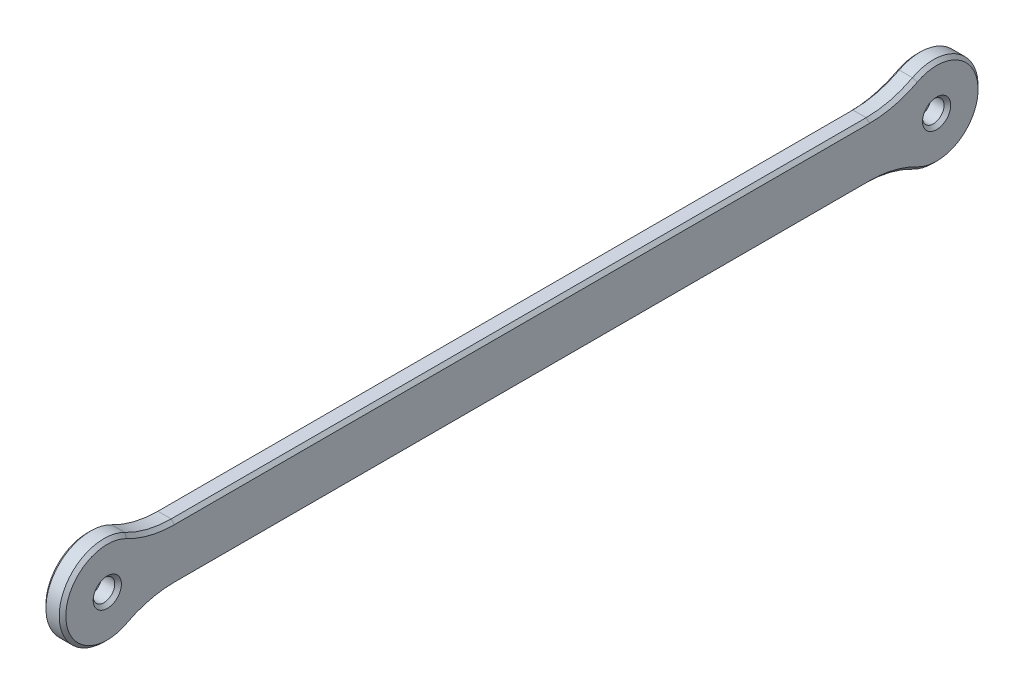
ISO-10303-21;
HEADER;
FILE_DESCRIPTION(('STEP AP214'),'2;1');
FILE_NAME('part.step','',(''),(''),'','','');
FILE_SCHEMA(('AUTOMOTIVE_DESIGN { 1 0 10303 214 1 1 1 1 }'));
ENDSEC;
DATA;
#1=APPLICATION_CONTEXT('core data for automotive mechanical design processes');
#2=APPLICATION_PROTOCOL_DEFINITION('international standard','automotive_design',2000,#1);
#3=PRODUCT_CONTEXT('',#1,'mechanical');
#4=PRODUCT('Part','Part','',(#3));
#5=PRODUCT_RELATED_PRODUCT_CATEGORY('part','',(#4));
#6=PRODUCT_DEFINITION_FORMATION('','',#4);
#7=PRODUCT_DEFINITION_CONTEXT('part definition',#1,'design');
#8=PRODUCT_DEFINITION('design','',#6,#7);
#9=PRODUCT_DEFINITION_SHAPE('','',#8);
#10=(LENGTH_UNIT() NAMED_UNIT(*) SI_UNIT(.MILLI.,.METRE.));
#11=(NAMED_UNIT(*) PLANE_ANGLE_UNIT() SI_UNIT($,.RADIAN.));
#12=(NAMED_UNIT(*) SI_UNIT($,.STERADIAN.) SOLID_ANGLE_UNIT());
#13=UNCERTAINTY_MEASURE_WITH_UNIT(LENGTH_MEASURE(1.E-05),#10,'distance_accuracy_value','');
#14=(GEOMETRIC_REPRESENTATION_CONTEXT(3) GLOBAL_UNCERTAINTY_ASSIGNED_CONTEXT((#13)) GLOBAL_UNIT_ASSIGNED_CONTEXT((#10,
#11,#12)) REPRESENTATION_CONTEXT('',''));
#15=CARTESIAN_POINT('',(0.,0.,0.));
#16=DIRECTION('',(0.,0.,1.));
#17=DIRECTION('',(1.,0.,0.));
#18=AXIS2_PLACEMENT_3D('',#15,#16,#17);
#19=CARTESIAN_POINT('',(1.5,19.25,-52.3757716343417));
#20=DIRECTION('',(-1.,0.,0.));
#21=DIRECTION('',(0.,0.,1.));
#22=AXIS2_PLACEMENT_3D('',#19,#20,#21);
#23=CYLINDRICAL_SURFACE('',#22,15.);
#24=DIRECTION('',(-1.,0.,0.));
#25=VECTOR('',#24,1.);
#26=CARTESIAN_POINT('',(1.5,5.97413793103448,-59.3579980934164));
#27=LINE('',#26,#25);
#28=CARTESIAN_POINT('',(1.00000000000007,5.97413793103448,-59.3579980934164));
#29=VERTEX_POINT('',#28);
#30=CARTESIAN_POINT('',(-1.00000000000001,5.97413793103448,-59.3579980934164));
#31=VERTEX_POINT('',#30);
#32=EDGE_CURVE('E261',#29,#31,#27,.T.);
#33=ORIENTED_EDGE('',*,*,#32,.T.);
#34=CARTESIAN_POINT('',(-1.00000000000001,19.25,-52.3757716343417));
#35=DIRECTION('',(1.,0.,0.));
#36=DIRECTION('',(0.,0.,-1.));
#37=AXIS2_PLACEMENT_3D('',#34,#35,#36);
#38=CIRCLE('',#37,15.);
#39=CARTESIAN_POINT('',(-1.00000000000001,4.25000000000001,-52.3757716343417));
#40=VERTEX_POINT('',#39);
#41=EDGE_CURVE('E212',#31,#40,#38,.F.);
#42=ORIENTED_EDGE('',*,*,#41,.T.);
#43=DIRECTION('',(-1.,0.,0.));
#44=VECTOR('',#43,1.);
#45=CARTESIAN_POINT('',(1.5,4.25000000000001,-52.3757716343417));
#46=LINE('',#45,#44);
#47=CARTESIAN_POINT('',(1.00000000000007,4.25000000000001,-52.3757716343417));
#48=VERTEX_POINT('',#47);
#49=EDGE_CURVE('E313',#48,#40,#46,.T.);
#50=ORIENTED_EDGE('',*,*,#49,.F.);
#51=CARTESIAN_POINT('',(1.00000000000007,19.25,-52.3757716343417));
#52=DIRECTION('',(1.,0.,0.));
#53=DIRECTION('',(0.,0.,-1.));
#54=AXIS2_PLACEMENT_3D('',#51,#52,#53);
#55=CIRCLE('',#54,15.);
#56=EDGE_CURVE('E210',#48,#29,#55,.T.);
#57=ORIENTED_EDGE('',*,*,#56,.T.);
#58=EDGE_LOOP('',(#33,#42,#50,#57));
#59=FACE_BOUND('',#58,.T.);
#60=ADVANCED_FACE('F37',(#59),#23,.F.);
#61=CARTESIAN_POINT('',(1.5,4.25,52.3757716343417));
#62=DIRECTION('',(0.,1.,0.));
#63=DIRECTION('',(0.,0.,1.));
#64=AXIS2_PLACEMENT_3D('',#61,#62,#63);
#65=PLANE('',#64);
#66=ORIENTED_EDGE('',*,*,#49,.T.);
#67=DIRECTION('',(0.,0.,1.));
#68=VECTOR('',#67,1.);
#69=CARTESIAN_POINT('',(-1.00000000000001,4.25,52.3757716343417));
#70=LINE('',#69,#68);
#71=CARTESIAN_POINT('',(-1.00000000000001,4.25,52.3757716343417));
#72=VERTEX_POINT('',#71);
#73=EDGE_CURVE('E158',#40,#72,#70,.T.);
#74=ORIENTED_EDGE('',*,*,#73,.T.);
#75=DIRECTION('',(-1.,0.,0.));
#76=VECTOR('',#75,1.);
#77=CARTESIAN_POINT('',(1.5,4.25,52.3757716343417));
#78=LINE('',#77,#76);
#79=CARTESIAN_POINT('',(1.00000000000007,4.25,52.3757716343417));
#80=VERTEX_POINT('',#79);
#81=EDGE_CURVE('E353',#80,#72,#78,.T.);
#82=ORIENTED_EDGE('',*,*,#81,.F.);
#83=DIRECTION('',(0.,0.,-1.));
#84=VECTOR('',#83,1.);
#85=CARTESIAN_POINT('',(1.00000000000007,4.25,52.3757716343417));
#86=LINE('',#85,#84);
#87=EDGE_CURVE('E177',#80,#48,#86,.T.);
#88=ORIENTED_EDGE('',*,*,#87,.T.);
#89=EDGE_LOOP('',(#66,#74,#82,#88));
#90=FACE_BOUND('',#89,.T.);
#91=ADVANCED_FACE('F352',(#90),#65,.T.);
#92=CARTESIAN_POINT('',(1.5,19.25,52.3757716343417));
#93=DIRECTION('',(-1.,0.,0.));
#94=DIRECTION('',(0.,0.,1.));
#95=AXIS2_PLACEMENT_3D('',#92,#93,#94);
#96=CYLINDRICAL_SURFACE('',#95,15.);
#97=ORIENTED_EDGE('',*,*,#81,.T.);
#98=CARTESIAN_POINT('',(-1.00000000000001,19.25,52.3757716343417));
#99=DIRECTION('',(1.,0.,0.));
#100=DIRECTION('',(0.,0.,-1.));
#101=AXIS2_PLACEMENT_3D('',#98,#99,#100);
#102=CIRCLE('',#101,15.);
#103=CARTESIAN_POINT('',(-1.00000000000001,5.97413793103448,59.3579980934164));
#104=VERTEX_POINT('',#103);
#105=EDGE_CURVE('E187',#72,#104,#102,.F.);
#106=ORIENTED_EDGE('',*,*,#105,.T.);
#107=DIRECTION('',(-1.,0.,0.));
#108=VECTOR('',#107,1.);
#109=CARTESIAN_POINT('',(1.5,5.97413793103448,59.3579980934164));
#110=LINE('',#109,#108);
#111=CARTESIAN_POINT('',(1.00000000000007,5.97413793103448,59.3579980934164));
#112=VERTEX_POINT('',#111);
#113=EDGE_CURVE('E355',#112,#104,#110,.T.);
#114=ORIENTED_EDGE('',*,*,#113,.F.);
#115=CARTESIAN_POINT('',(1.00000000000007,19.25,52.3757716343417));
#116=DIRECTION('',(1.,0.,0.));
#117=DIRECTION('',(0.,0.,-1.));
#118=AXIS2_PLACEMENT_3D('',#115,#116,#117);
#119=CIRCLE('',#118,15.);
#120=EDGE_CURVE('E185',#112,#80,#119,.T.);
#121=ORIENTED_EDGE('',*,*,#120,.T.);
#122=EDGE_LOOP('',(#97,#106,#114,#121));
#123=FACE_BOUND('',#122,.T.);
#124=ADVANCED_FACE('F354',(#123),#96,.F.);
#125=CARTESIAN_POINT('',(1.5,0.,62.5));
#126=DIRECTION('',(-1.,0.,0.));
#127=DIRECTION('',(0.,0.,1.));
#128=AXIS2_PLACEMENT_3D('',#125,#126,#127);
#129=CYLINDRICAL_SURFACE('',#128,6.75);
#130=ORIENTED_EDGE('',*,*,#113,.T.);
#131=CARTESIAN_POINT('',(-1.00000000000001,0.,62.5));
#132=DIRECTION('',(1.,0.,0.));
#133=DIRECTION('',(0.,0.,-1.));
#134=AXIS2_PLACEMENT_3D('',#131,#132,#133);
#135=CIRCLE('',#134,6.75);
#136=CARTESIAN_POINT('',(-1.00000000000001,-5.97413793103449,59.3579980934164));
#137=VERTEX_POINT('',#136);
#138=EDGE_CURVE('E191',#104,#137,#135,.T.);
#139=ORIENTED_EDGE('',*,*,#138,.T.);
#140=DIRECTION('',(-1.,0.,0.));
#141=VECTOR('',#140,1.);
#142=CARTESIAN_POINT('',(1.5,-5.97413793103449,59.3579980934164));
#143=LINE('',#142,#141);
#144=CARTESIAN_POINT('',(1.00000000000007,-5.97413793103449,59.3579980934164));
#145=VERTEX_POINT('',#144);
#146=EDGE_CURVE('E358',#145,#137,#143,.T.);
#147=ORIENTED_EDGE('',*,*,#146,.F.);
#148=CARTESIAN_POINT('',(1.00000000000007,0.,62.5));
#149=DIRECTION('',(1.,0.,0.));
#150=DIRECTION('',(0.,0.,-1.));
#151=AXIS2_PLACEMENT_3D('',#148,#149,#150);
#152=CIRCLE('',#151,6.75);
#153=EDGE_CURVE('E189',#145,#112,#152,.F.);
#154=ORIENTED_EDGE('',*,*,#153,.T.);
#155=EDGE_LOOP('',(#130,#139,#147,#154));
#156=FACE_BOUND('',#155,.T.);
#157=ADVANCED_FACE('F504',(#156),#129,.T.);
#158=CARTESIAN_POINT('',(1.5,-19.25,52.3757716343417));
#159=DIRECTION('',(-1.,0.,0.));
#160=DIRECTION('',(0.,0.,1.));
#161=AXIS2_PLACEMENT_3D('',#158,#159,#160);
#162=CYLINDRICAL_SURFACE('',#161,15.);
#163=ORIENTED_EDGE('',*,*,#146,.T.);
#164=CARTESIAN_POINT('',(-1.00000000000001,-19.25,52.3757716343417));
#165=DIRECTION('',(1.,0.,0.));
#166=DIRECTION('',(0.,0.,-1.));
#167=AXIS2_PLACEMENT_3D('',#164,#165,#166);
#168=CIRCLE('',#167,15.);
#169=CARTESIAN_POINT('',(-1.00000000000001,-4.25000000000001,52.3757716343417));
#170=VERTEX_POINT('',#169);
#171=EDGE_CURVE('E195',#137,#170,#168,.F.);
#172=ORIENTED_EDGE('',*,*,#171,.T.);
#173=DIRECTION('',(-1.,0.,0.));
#174=VECTOR('',#173,1.);
#175=CARTESIAN_POINT('',(1.5,-4.25000000000001,52.3757716343417));
#176=LINE('',#175,#174);
#177=CARTESIAN_POINT('',(1.00000000000007,-4.25000000000001,52.3757716343417));
#178=VERTEX_POINT('',#177);
#179=EDGE_CURVE('E363',#178,#170,#176,.T.);
#180=ORIENTED_EDGE('',*,*,#179,.F.);
#181=CARTESIAN_POINT('',(1.00000000000007,-19.25,52.3757716343417));
#182=DIRECTION('',(1.,0.,0.));
#183=DIRECTION('',(0.,0.,-1.));
#184=AXIS2_PLACEMENT_3D('',#181,#182,#183);
#185=CIRCLE('',#184,15.);
#186=EDGE_CURVE('E193',#178,#145,#185,.T.);
#187=ORIENTED_EDGE('',*,*,#186,.T.);
#188=EDGE_LOOP('',(#163,#172,#180,#187));
#189=FACE_BOUND('',#188,.T.);
#190=ADVANCED_FACE('F390',(#189),#162,.F.);
#191=CARTESIAN_POINT('',(1.5,-4.25,-52.3757716343417));
#192=DIRECTION('',(0.,-1.,0.));
#193=DIRECTION('',(0.,0.,-1.));
#194=AXIS2_PLACEMENT_3D('',#191,#192,#193);
#195=PLANE('',#194);
#196=ORIENTED_EDGE('',*,*,#179,.T.);
#197=DIRECTION('',(0.,0.,-1.));
#198=VECTOR('',#197,1.);
#199=CARTESIAN_POINT('',(-1.00000000000001,-4.25,-52.3757716343417));
#200=LINE('',#199,#198);
#201=CARTESIAN_POINT('',(-1.00000000000001,-4.25,-52.3757716343417));
#202=VERTEX_POINT('',#201);
#203=EDGE_CURVE('E199',#170,#202,#200,.T.);
#204=ORIENTED_EDGE('',*,*,#203,.T.);
#205=DIRECTION('',(-1.,0.,0.));
#206=VECTOR('',#205,1.);
#207=CARTESIAN_POINT('',(1.5,-4.25,-52.3757716343417));
#208=LINE('',#207,#206);
#209=CARTESIAN_POINT('',(1.00000000000007,-4.25,-52.3757716343417));
#210=VERTEX_POINT('',#209);
#211=EDGE_CURVE('E321',#210,#202,#208,.T.);
#212=ORIENTED_EDGE('',*,*,#211,.F.);
#213=DIRECTION('',(0.,0.,1.));
#214=VECTOR('',#213,1.);
#215=CARTESIAN_POINT('',(1.00000000000007,-4.25,-52.3757716343417));
#216=LINE('',#215,#214);
#217=EDGE_CURVE('E197',#210,#178,#216,.T.);
#218=ORIENTED_EDGE('',*,*,#217,.T.);
#219=EDGE_LOOP('',(#196,#204,#212,#218));
#220=FACE_BOUND('',#219,.T.);
#221=ADVANCED_FACE('F392',(#220),#195,.T.);
#222=CARTESIAN_POINT('',(1.5,-19.25,-52.3757716343417));
#223=DIRECTION('',(-1.,0.,0.));
#224=DIRECTION('',(0.,0.,1.));
#225=AXIS2_PLACEMENT_3D('',#222,#223,#224);
#226=CYLINDRICAL_SURFACE('',#225,15.);
#227=ORIENTED_EDGE('',*,*,#211,.T.);
#228=CARTESIAN_POINT('',(-1.00000000000001,-19.25,-52.3757716343417));
#229=DIRECTION('',(1.,0.,0.));
#230=DIRECTION('',(0.,0.,-1.));
#231=AXIS2_PLACEMENT_3D('',#228,#229,#230);
#232=CIRCLE('',#231,15.);
#233=CARTESIAN_POINT('',(-1.00000000000001,-5.97413793103448,-59.3579980934164));
#234=VERTEX_POINT('',#233);
#235=EDGE_CURVE('E203',#202,#234,#232,.F.);
#236=ORIENTED_EDGE('',*,*,#235,.T.);
#237=DIRECTION('',(-1.,0.,0.));
#238=VECTOR('',#237,1.);
#239=CARTESIAN_POINT('',(1.5,-5.97413793103448,-59.3579980934164));
#240=LINE('',#239,#238);
#241=CARTESIAN_POINT('',(1.00000000000007,-5.97413793103448,-59.3579980934164));
#242=VERTEX_POINT('',#241);
#243=EDGE_CURVE('E319',#242,#234,#240,.T.);
#244=ORIENTED_EDGE('',*,*,#243,.F.);
#245=CARTESIAN_POINT('',(1.00000000000007,-19.25,-52.3757716343417));
#246=DIRECTION('',(1.,0.,0.));
#247=DIRECTION('',(0.,0.,-1.));
#248=AXIS2_PLACEMENT_3D('',#245,#246,#247);
#249=CIRCLE('',#248,15.);
#250=EDGE_CURVE('E201',#242,#210,#249,.T.);
#251=ORIENTED_EDGE('',*,*,#250,.T.);
#252=EDGE_LOOP('',(#227,#236,#244,#251));
#253=FACE_BOUND('',#252,.T.);
#254=ADVANCED_FACE('F369',(#253),#226,.F.);
#255=CARTESIAN_POINT('',(1.5,0.,-62.5));
#256=DIRECTION('',(-1.,0.,0.));
#257=DIRECTION('',(0.,0.,1.));
#258=AXIS2_PLACEMENT_3D('',#255,#256,#257);
#259=CYLINDRICAL_SURFACE('',#258,6.74999999999999);
#260=ORIENTED_EDGE('',*,*,#243,.T.);
#261=CARTESIAN_POINT('',(-1.00000000000001,0.,-62.5));
#262=DIRECTION('',(1.,0.,0.));
#263=DIRECTION('',(0.,0.,-1.));
#264=AXIS2_PLACEMENT_3D('',#261,#262,#263);
#265=CIRCLE('',#264,6.74999999999999);
#266=EDGE_CURVE('E208',#234,#31,#265,.T.);
#267=ORIENTED_EDGE('',*,*,#266,.T.);
#268=ORIENTED_EDGE('',*,*,#32,.F.);
#269=CARTESIAN_POINT('',(1.00000000000007,0.,-62.5));
#270=DIRECTION('',(1.,0.,0.));
#271=DIRECTION('',(0.,0.,-1.));
#272=AXIS2_PLACEMENT_3D('',#269,#270,#271);
#273=CIRCLE('',#272,6.74999999999999);
#274=EDGE_CURVE('E205',#29,#242,#273,.F.);
#275=ORIENTED_EDGE('',*,*,#274,.T.);
#276=EDGE_LOOP('',(#260,#267,#268,#275));
#277=FACE_BOUND('',#276,.T.);
#278=ADVANCED_FACE('F316',(#277),#259,.T.);
#279=CARTESIAN_POINT('',(1.5,19.25,-52.3757716343417));
#280=DIRECTION('',(1.,0.,0.));
#281=DIRECTION('',(0.,0.,-1.));
#282=AXIS2_PLACEMENT_3D('',#279,#280,#281);
#283=PLANE('',#282);
#284=CARTESIAN_POINT('',(1.5,-19.25,-52.3757716343417));
#285=DIRECTION('',(1.,0.,0.));
#286=DIRECTION('',(0.,0.,-1.));
#287=AXIS2_PLACEMENT_3D('',#284,#285,#286);
#288=CIRCLE('',#287,15.4999999999999);
#289=CARTESIAN_POINT('',(1.5,-3.75000000000007,-52.3757716343417));
#290=VERTEX_POINT('',#289);
#291=CARTESIAN_POINT('',(1.5,-5.53160919540235,-59.5907389753855));
#292=VERTEX_POINT('',#291);
#293=EDGE_CURVE('E47',#290,#292,#288,.F.);
#294=ORIENTED_EDGE('',*,*,#293,.T.);
#295=CARTESIAN_POINT('',(1.5,0.,-62.5));
#296=DIRECTION('',(1.,0.,0.));
#297=DIRECTION('',(0.,0.,-1.));
#298=AXIS2_PLACEMENT_3D('',#295,#296,#297);
#299=CIRCLE('',#298,6.25000000000006);
#300=CARTESIAN_POINT('',(1.5,5.53160919540235,-59.5907389753855));
#301=VERTEX_POINT('',#300);
#302=EDGE_CURVE('E12',#292,#301,#299,.T.);
#303=ORIENTED_EDGE('',*,*,#302,.T.);
#304=CARTESIAN_POINT('',(1.5,19.25,-52.3757716343417));
#305=DIRECTION('',(1.,0.,0.));
#306=DIRECTION('',(0.,0.,-1.));
#307=AXIS2_PLACEMENT_3D('',#304,#305,#306);
#308=CIRCLE('',#307,15.4999999999999);
#309=CARTESIAN_POINT('',(1.5,3.75000000000008,-52.3757716343417));
#310=VERTEX_POINT('',#309);
#311=EDGE_CURVE('E232',#301,#310,#308,.F.);
#312=ORIENTED_EDGE('',*,*,#311,.T.);
#313=DIRECTION('',(0.,0.,1.));
#314=VECTOR('',#313,1.);
#315=CARTESIAN_POINT('',(1.5,3.75000000000008,-52.3757716343417));
#316=LINE('',#315,#314);
#317=CARTESIAN_POINT('',(1.5,3.75000000000006,52.3757716343417));
#318=VERTEX_POINT('',#317);
#319=EDGE_CURVE('E234',#310,#318,#316,.T.);
#320=ORIENTED_EDGE('',*,*,#319,.T.);
#321=CARTESIAN_POINT('',(1.5,19.25,52.3757716343417));
#322=DIRECTION('',(1.,0.,0.));
#323=DIRECTION('',(0.,0.,-1.));
#324=AXIS2_PLACEMENT_3D('',#321,#322,#323);
#325=CIRCLE('',#324,15.4999999999999);
#326=CARTESIAN_POINT('',(1.5,5.53160919540236,59.5907389753855));
#327=VERTEX_POINT('',#326);
#328=EDGE_CURVE('E236',#318,#327,#325,.F.);
#329=ORIENTED_EDGE('',*,*,#328,.T.);
#330=CARTESIAN_POINT('',(1.5,0.,62.5));
#331=DIRECTION('',(1.,0.,0.));
#332=DIRECTION('',(0.,0.,-1.));
#333=AXIS2_PLACEMENT_3D('',#330,#331,#332);
#334=CIRCLE('',#333,6.25000000000007);
#335=CARTESIAN_POINT('',(1.5,-5.53160919540237,59.5907389753855));
#336=VERTEX_POINT('',#335);
#337=EDGE_CURVE('E238',#327,#336,#334,.T.);
#338=ORIENTED_EDGE('',*,*,#337,.T.);
#339=CARTESIAN_POINT('',(1.5,-19.25,52.3757716343417));
#340=DIRECTION('',(1.,0.,0.));
#341=DIRECTION('',(0.,0.,-1.));
#342=AXIS2_PLACEMENT_3D('',#339,#340,#341);
#343=CIRCLE('',#342,15.4999999999999);
#344=CARTESIAN_POINT('',(1.5,-3.75000000000008,52.3757716343417));
#345=VERTEX_POINT('',#344);
#346=EDGE_CURVE('E240',#336,#345,#343,.F.);
#347=ORIENTED_EDGE('',*,*,#346,.T.);
#348=DIRECTION('',(0.,0.,-1.));
#349=VECTOR('',#348,1.);
#350=CARTESIAN_POINT('',(1.5,-3.75000000000007,-52.3757716343417));
#351=LINE('',#350,#349);
#352=EDGE_CURVE('E58',#345,#290,#351,.T.);
#353=ORIENTED_EDGE('',*,*,#352,.T.);
#354=EDGE_LOOP('',(#294,#303,#312,#320,#329,#338,#347,#353));
#355=FACE_BOUND('',#354,.T.);
#356=CARTESIAN_POINT('',(1.5,0.,-62.5));
#357=DIRECTION('',(1.,0.,0.));
#358=DIRECTION('',(0.,0.,-1.));
#359=AXIS2_PLACEMENT_3D('',#356,#357,#358);
#360=CIRCLE('',#359,2.12500000000001);
#361=CARTESIAN_POINT('',(1.5,0.,-64.625));
#362=VERTEX_POINT('',#361);
#363=EDGE_CURVE('E229',#362,#362,#360,.F.);
#364=ORIENTED_EDGE('',*,*,#363,.T.);
#365=EDGE_LOOP('',(#364));
#366=FACE_BOUND('',#365,.T.);
#367=CARTESIAN_POINT('',(1.5,0.,62.5));
#368=DIRECTION('',(1.,0.,0.));
#369=DIRECTION('',(0.,0.,-1.));
#370=AXIS2_PLACEMENT_3D('',#367,#368,#369);
#371=CIRCLE('',#370,2.12500000000001);
#372=CARTESIAN_POINT('',(1.5,0.,60.375));
#373=VERTEX_POINT('',#372);
#374=EDGE_CURVE('E226',#373,#373,#371,.F.);
#375=ORIENTED_EDGE('',*,*,#374,.T.);
#376=EDGE_LOOP('',(#375));
#377=FACE_BOUND('',#376,.T.);
#378=ADVANCED_FACE('F294',(#355,#366,#377),#283,.T.);
#379=CARTESIAN_POINT('',(-1.5,19.25,-52.3757716343417));
#380=DIRECTION('',(1.,0.,0.));
#381=DIRECTION('',(0.,0.,-1.));
#382=AXIS2_PLACEMENT_3D('',#379,#380,#381);
#383=PLANE('',#382);
#384=CARTESIAN_POINT('',(-1.5,0.,62.5));
#385=DIRECTION('',(1.,0.,0.));
#386=DIRECTION('',(0.,0.,-1.));
#387=AXIS2_PLACEMENT_3D('',#384,#385,#386);
#388=CIRCLE('',#387,2.125);
#389=CARTESIAN_POINT('',(-1.5,0.,60.375));
#390=VERTEX_POINT('',#389);
#391=EDGE_CURVE('E325',#390,#390,#388,.T.);
#392=ORIENTED_EDGE('',*,*,#391,.T.);
#393=EDGE_LOOP('',(#392));
#394=FACE_BOUND('',#393,.T.);
#395=CARTESIAN_POINT('',(-1.5,0.,-62.5));
#396=DIRECTION('',(1.,0.,0.));
#397=DIRECTION('',(0.,0.,-1.));
#398=AXIS2_PLACEMENT_3D('',#395,#396,#397);
#399=CIRCLE('',#398,2.12500000000001);
#400=CARTESIAN_POINT('',(-1.5,0.,-64.625));
#401=VERTEX_POINT('',#400);
#402=EDGE_CURVE('E171',#401,#401,#399,.T.);
#403=ORIENTED_EDGE('',*,*,#402,.T.);
#404=EDGE_LOOP('',(#403));
#405=FACE_BOUND('',#404,.T.);
#406=CARTESIAN_POINT('',(-1.5,19.25,52.3757716343417));
#407=DIRECTION('',(1.,0.,0.));
#408=DIRECTION('',(0.,0.,-1.));
#409=AXIS2_PLACEMENT_3D('',#406,#407,#408);
#410=CIRCLE('',#409,15.5);
#411=CARTESIAN_POINT('',(-1.5,5.53160919540231,59.5907389753855));
#412=VERTEX_POINT('',#411);
#413=CARTESIAN_POINT('',(-1.5,3.75000000000001,52.3757716343417));
#414=VERTEX_POINT('',#413);
#415=EDGE_CURVE('E175',#412,#414,#410,.T.);
#416=ORIENTED_EDGE('',*,*,#415,.T.);
#417=DIRECTION('',(0.,0.,-1.));
#418=VECTOR('',#417,1.);
#419=CARTESIAN_POINT('',(-1.5,3.75000000000002,-52.3757716343417));
#420=LINE('',#419,#418);
#421=CARTESIAN_POINT('',(-1.5,3.75000000000002,-52.3757716343417));
#422=VERTEX_POINT('',#421);
#423=EDGE_CURVE('E156',#414,#422,#420,.T.);
#424=ORIENTED_EDGE('',*,*,#423,.T.);
#425=CARTESIAN_POINT('',(-1.5,19.25,-52.3757716343417));
#426=DIRECTION('',(1.,0.,0.));
#427=DIRECTION('',(0.,0.,-1.));
#428=AXIS2_PLACEMENT_3D('',#425,#426,#427);
#429=CIRCLE('',#428,15.5);
#430=CARTESIAN_POINT('',(-1.5,5.53160919540231,-59.5907389753855));
#431=VERTEX_POINT('',#430);
#432=EDGE_CURVE('E164',#422,#431,#429,.T.);
#433=ORIENTED_EDGE('',*,*,#432,.T.);
#434=CARTESIAN_POINT('',(-1.5,0.,-62.5));
#435=DIRECTION('',(1.,0.,0.));
#436=DIRECTION('',(0.,0.,-1.));
#437=AXIS2_PLACEMENT_3D('',#434,#435,#436);
#438=CIRCLE('',#437,6.25);
#439=CARTESIAN_POINT('',(-1.5,-5.53160919540231,-59.5907389753855));
#440=VERTEX_POINT('',#439);
#441=EDGE_CURVE('E170',#431,#440,#438,.F.);
#442=ORIENTED_EDGE('',*,*,#441,.T.);
#443=CARTESIAN_POINT('',(-1.5,-19.25,-52.3757716343417));
#444=DIRECTION('',(1.,0.,0.));
#445=DIRECTION('',(0.,0.,-1.));
#446=AXIS2_PLACEMENT_3D('',#443,#444,#445);
#447=CIRCLE('',#446,15.5);
#448=CARTESIAN_POINT('',(-1.5,-3.75000000000001,-52.3757716343417));
#449=VERTEX_POINT('',#448);
#450=EDGE_CURVE('E331',#440,#449,#447,.T.);
#451=ORIENTED_EDGE('',*,*,#450,.T.);
#452=DIRECTION('',(0.,0.,1.));
#453=VECTOR('',#452,1.);
#454=CARTESIAN_POINT('',(-1.5,-3.75000000000002,52.3757716343417));
#455=LINE('',#454,#453);
#456=CARTESIAN_POINT('',(-1.5,-3.75000000000002,52.3757716343417));
#457=VERTEX_POINT('',#456);
#458=EDGE_CURVE('E333',#449,#457,#455,.T.);
#459=ORIENTED_EDGE('',*,*,#458,.T.);
#460=CARTESIAN_POINT('',(-1.5,-19.25,52.3757716343417));
#461=DIRECTION('',(1.,0.,0.));
#462=DIRECTION('',(0.,0.,-1.));
#463=AXIS2_PLACEMENT_3D('',#460,#461,#462);
#464=CIRCLE('',#463,15.5);
#465=CARTESIAN_POINT('',(-1.5,-5.53160919540232,59.5907389753855));
#466=VERTEX_POINT('',#465);
#467=EDGE_CURVE('E335',#457,#466,#464,.T.);
#468=ORIENTED_EDGE('',*,*,#467,.T.);
#469=CARTESIAN_POINT('',(-1.5,0.,62.5));
#470=DIRECTION('',(1.,0.,0.));
#471=DIRECTION('',(0.,0.,-1.));
#472=AXIS2_PLACEMENT_3D('',#469,#470,#471);
#473=CIRCLE('',#472,6.25000000000001);
#474=EDGE_CURVE('E180',#466,#412,#473,.F.);
#475=ORIENTED_EDGE('',*,*,#474,.T.);
#476=EDGE_LOOP('',(#416,#424,#433,#442,#451,#459,#468,#475));
#477=FACE_BOUND('',#476,.T.);
#478=ADVANCED_FACE('F173',(#394,#405,#477),#383,.F.);
#479=CARTESIAN_POINT('',(1.5,0.,-62.5));
#480=DIRECTION('',(-1.,0.,0.));
#481=DIRECTION('',(0.,0.,1.));
#482=AXIS2_PLACEMENT_3D('',#479,#480,#481);
#483=CYLINDRICAL_SURFACE('',#482,1.62500000000001);
#484=CARTESIAN_POINT('',(-1.,0.,-62.5));
#485=DIRECTION('',(1.,0.,0.));
#486=DIRECTION('',(0.,0.,-1.));
#487=AXIS2_PLACEMENT_3D('',#484,#485,#486);
#488=CIRCLE('',#487,1.62500000000001);
#489=CARTESIAN_POINT('',(-1.,0.,-64.125));
#490=VERTEX_POINT('',#489);
#491=EDGE_CURVE('E217',#490,#490,#488,.F.);
#492=ORIENTED_EDGE('',*,*,#491,.T.);
#493=EDGE_LOOP('',(#492));
#494=FACE_BOUND('',#493,.T.);
#495=CARTESIAN_POINT('',(1.00000000000001,0.,-62.5));
#496=DIRECTION('',(1.,0.,0.));
#497=DIRECTION('',(0.,0.,-1.));
#498=AXIS2_PLACEMENT_3D('',#495,#496,#497);
#499=CIRCLE('',#498,1.62500000000001);
#500=CARTESIAN_POINT('',(1.00000000000001,0.,-64.125));
#501=VERTEX_POINT('',#500);
#502=EDGE_CURVE('E214',#501,#501,#499,.T.);
#503=ORIENTED_EDGE('',*,*,#502,.T.);
#504=EDGE_LOOP('',(#503));
#505=FACE_BOUND('',#504,.T.);
#506=ADVANCED_FACE('F484',(#494,#505),#483,.F.);
#507=CARTESIAN_POINT('',(1.5,0.,62.5));
#508=DIRECTION('',(-1.,0.,0.));
#509=DIRECTION('',(0.,0.,1.));
#510=AXIS2_PLACEMENT_3D('',#507,#508,#509);
#511=CYLINDRICAL_SURFACE('',#510,1.62500000000001);
#512=CARTESIAN_POINT('',(-1.,0.,62.5));
#513=DIRECTION('',(1.,0.,0.));
#514=DIRECTION('',(0.,0.,-1.));
#515=AXIS2_PLACEMENT_3D('',#512,#513,#514);
#516=CIRCLE('',#515,1.62500000000001);
#517=CARTESIAN_POINT('',(-1.,0.,60.875));
#518=VERTEX_POINT('',#517);
#519=EDGE_CURVE('E223',#518,#518,#516,.F.);
#520=ORIENTED_EDGE('',*,*,#519,.T.);
#521=EDGE_LOOP('',(#520));
#522=FACE_BOUND('',#521,.T.);
#523=CARTESIAN_POINT('',(1.00000000000001,0.,62.5));
#524=DIRECTION('',(1.,0.,0.));
#525=DIRECTION('',(0.,0.,-1.));
#526=AXIS2_PLACEMENT_3D('',#523,#524,#525);
#527=CIRCLE('',#526,1.62500000000001);
#528=CARTESIAN_POINT('',(1.00000000000001,0.,60.875));
#529=VERTEX_POINT('',#528);
#530=EDGE_CURVE('E220',#529,#529,#527,.T.);
#531=ORIENTED_EDGE('',*,*,#530,.T.);
#532=EDGE_LOOP('',(#531));
#533=FACE_BOUND('',#532,.T.);
#534=ADVANCED_FACE('F462',(#522,#533),#511,.F.);
#535=CARTESIAN_POINT('',(-1.5,-3.75000000000001,-52.3757716343417));
#536=DIRECTION('',(-0.707106781186546,-0.707106781186549,0.));
#537=DIRECTION('',(0.,0.,-1.));
#538=AXIS2_PLACEMENT_3D('',#535,#536,#537);
#539=PLANE('',#538);
#540=DIRECTION('',(-0.707106781186549,0.707106781186546,0.));
#541=VECTOR('',#540,1.);
#542=CARTESIAN_POINT('',(-1.00000000000001,-4.25,-52.3757716343417));
#543=LINE('',#542,#541);
#544=EDGE_CURVE('E255',#202,#449,#543,.T.);
#545=ORIENTED_EDGE('',*,*,#544,.F.);
#546=ORIENTED_EDGE('',*,*,#203,.F.);
#547=DIRECTION('',(0.707106781186549,-0.707106781186546,0.));
#548=VECTOR('',#547,1.);
#549=CARTESIAN_POINT('',(-1.5,-3.75000000000002,52.3757716343417));
#550=LINE('',#549,#548);
#551=EDGE_CURVE('E258',#457,#170,#550,.T.);
#552=ORIENTED_EDGE('',*,*,#551,.F.);
#553=ORIENTED_EDGE('',*,*,#458,.F.);
#554=EDGE_LOOP('',(#545,#546,#552,#553));
#555=FACE_BOUND('',#554,.T.);
#556=ADVANCED_FACE('F377',(#555),#539,.T.);
#557=CARTESIAN_POINT('',(-1.5,-19.25,52.3757716343417));
#558=DIRECTION('',(-1.,0.,0.));
#559=DIRECTION('',(0.,0.,1.));
#560=AXIS2_PLACEMENT_3D('',#557,#558,#559);
#561=CONICAL_SURFACE('',#560,15.5,0.785398163397445);
#562=ORIENTED_EDGE('',*,*,#551,.T.);
#563=ORIENTED_EDGE('',*,*,#171,.F.);
#564=DIRECTION('',(0.707106781186551,-0.625830139670847,-0.329145311799458));
#565=VECTOR('',#564,1.);
#566=CARTESIAN_POINT('',(-1.5,-5.53160919540232,59.5907389753855));
#567=LINE('',#566,#565);
#568=EDGE_CURVE('E252',#466,#137,#567,.T.);
#569=ORIENTED_EDGE('',*,*,#568,.F.);
#570=ORIENTED_EDGE('',*,*,#467,.F.);
#571=EDGE_LOOP('',(#562,#563,#569,#570));
#572=FACE_BOUND('',#571,.T.);
#573=ADVANCED_FACE('F387',(#572),#561,.F.);
#574=CARTESIAN_POINT('',(-1.5,-19.25,-52.3757716343417));
#575=DIRECTION('',(-1.,0.,0.));
#576=DIRECTION('',(0.,0.,1.));
#577=AXIS2_PLACEMENT_3D('',#574,#575,#576);
#578=CONICAL_SURFACE('',#577,15.5,0.785398163397447);
#579=ORIENTED_EDGE('',*,*,#544,.T.);
#580=ORIENTED_EDGE('',*,*,#450,.F.);
#581=DIRECTION('',(-0.707106781186549,0.62583013967085,-0.329145311799457));
#582=VECTOR('',#581,1.);
#583=CARTESIAN_POINT('',(-1.00000000000001,-5.97413793103448,-59.3579980934164));
#584=LINE('',#583,#582);
#585=EDGE_CURVE('E249',#234,#440,#584,.T.);
#586=ORIENTED_EDGE('',*,*,#585,.F.);
#587=ORIENTED_EDGE('',*,*,#235,.F.);
#588=EDGE_LOOP('',(#579,#580,#586,#587));
#589=FACE_BOUND('',#588,.T.);
#590=ADVANCED_FACE('F382',(#589),#578,.F.);
#591=CARTESIAN_POINT('',(-1.5,0.,62.5));
#592=DIRECTION('',(1.,0.,0.));
#593=DIRECTION('',(0.,0.,-1.));
#594=AXIS2_PLACEMENT_3D('',#591,#592,#593);
#595=CONICAL_SURFACE('',#594,6.25000000000001,0.785398163397446);
#596=ORIENTED_EDGE('',*,*,#568,.T.);
#597=ORIENTED_EDGE('',*,*,#138,.F.);
#598=DIRECTION('',(0.707106781186549,0.62583013967085,-0.329145311799457));
#599=VECTOR('',#598,1.);
#600=CARTESIAN_POINT('',(-1.5,5.53160919540231,59.5907389753855));
#601=LINE('',#600,#599);
#602=EDGE_CURVE('E246',#412,#104,#601,.T.);
#603=ORIENTED_EDGE('',*,*,#602,.F.);
#604=ORIENTED_EDGE('',*,*,#474,.F.);
#605=EDGE_LOOP('',(#596,#597,#603,#604));
#606=FACE_BOUND('',#605,.T.);
#607=ADVANCED_FACE('F342',(#606),#595,.T.);
#608=CARTESIAN_POINT('',(-1.5,0.,-62.5));
#609=DIRECTION('',(1.,0.,0.));
#610=DIRECTION('',(0.,0.,-1.));
#611=AXIS2_PLACEMENT_3D('',#608,#609,#610);
#612=CONICAL_SURFACE('',#611,6.25,0.785398163397446);
#613=ORIENTED_EDGE('',*,*,#585,.T.);
#614=ORIENTED_EDGE('',*,*,#441,.F.);
#615=DIRECTION('',(-0.707106781186549,-0.62583013967085,-0.329145311799457));
#616=VECTOR('',#615,1.);
#617=CARTESIAN_POINT('',(-1.00000000000001,5.97413793103448,-59.3579980934164));
#618=LINE('',#617,#616);
#619=EDGE_CURVE('E167',#31,#431,#618,.T.);
#620=ORIENTED_EDGE('',*,*,#619,.F.);
#621=ORIENTED_EDGE('',*,*,#266,.F.);
#622=EDGE_LOOP('',(#613,#614,#620,#621));
#623=FACE_BOUND('',#622,.T.);
#624=ADVANCED_FACE('F384',(#623),#612,.T.);
#625=CARTESIAN_POINT('',(-1.5,19.25,52.3757716343417));
#626=DIRECTION('',(-1.,0.,0.));
#627=DIRECTION('',(0.,0.,1.));
#628=AXIS2_PLACEMENT_3D('',#625,#626,#627);
#629=CONICAL_SURFACE('',#628,15.5,0.785398163397447);
#630=ORIENTED_EDGE('',*,*,#602,.T.);
#631=ORIENTED_EDGE('',*,*,#105,.F.);
#632=DIRECTION('',(0.707106781186549,0.707106781186546,0.));
#633=VECTOR('',#632,1.);
#634=CARTESIAN_POINT('',(-1.5,3.75000000000001,52.3757716343417));
#635=LINE('',#634,#633);
#636=EDGE_CURVE('E161',#414,#72,#635,.T.);
#637=ORIENTED_EDGE('',*,*,#636,.F.);
#638=ORIENTED_EDGE('',*,*,#415,.F.);
#639=EDGE_LOOP('',(#630,#631,#637,#638));
#640=FACE_BOUND('',#639,.T.);
#641=ADVANCED_FACE('F345',(#640),#629,.F.);
#642=CARTESIAN_POINT('',(-1.5,19.25,-52.3757716343417));
#643=DIRECTION('',(-1.,0.,0.));
#644=DIRECTION('',(0.,0.,1.));
#645=AXIS2_PLACEMENT_3D('',#642,#643,#644);
#646=CONICAL_SURFACE('',#645,15.5,0.785398163397445);
#647=ORIENTED_EDGE('',*,*,#619,.T.);
#648=ORIENTED_EDGE('',*,*,#432,.F.);
#649=DIRECTION('',(-0.707106781186551,-0.707106781186544,0.));
#650=VECTOR('',#649,1.);
#651=CARTESIAN_POINT('',(-1.00000000000001,4.25000000000001,-52.3757716343417));
#652=LINE('',#651,#650);
#653=EDGE_CURVE('E152',#40,#422,#652,.T.);
#654=ORIENTED_EDGE('',*,*,#653,.F.);
#655=ORIENTED_EDGE('',*,*,#41,.F.);
#656=EDGE_LOOP('',(#647,#648,#654,#655));
#657=FACE_BOUND('',#656,.T.);
#658=ADVANCED_FACE('F165',(#657),#646,.F.);
#659=CARTESIAN_POINT('',(-1.5,3.75000000000002,-52.3757716343417));
#660=DIRECTION('',(-0.707106781186546,0.707106781186549,0.));
#661=DIRECTION('',(0.,0.,1.));
#662=AXIS2_PLACEMENT_3D('',#659,#660,#661);
#663=PLANE('',#662);
#664=ORIENTED_EDGE('',*,*,#636,.T.);
#665=ORIENTED_EDGE('',*,*,#73,.F.);
#666=ORIENTED_EDGE('',*,*,#653,.T.);
#667=ORIENTED_EDGE('',*,*,#423,.F.);
#668=EDGE_LOOP('',(#664,#665,#666,#667));
#669=FACE_BOUND('',#668,.T.);
#670=ADVANCED_FACE('F154',(#669),#663,.T.);
#671=CARTESIAN_POINT('',(-1.,0.,-62.5));
#672=DIRECTION('',(-1.,0.,0.));
#673=DIRECTION('',(0.,0.,1.));
#674=AXIS2_PLACEMENT_3D('',#671,#672,#673);
#675=CONICAL_SURFACE('',#674,1.62500000000001,0.785398163397443);
#676=ORIENTED_EDGE('',*,*,#402,.F.);
#677=EDGE_LOOP('',(#676));
#678=FACE_BOUND('',#677,.T.);
#679=ORIENTED_EDGE('',*,*,#491,.F.);
#680=EDGE_LOOP('',(#679));
#681=FACE_BOUND('',#680,.T.);
#682=ADVANCED_FACE('F427',(#678,#681),#675,.F.);
#683=CARTESIAN_POINT('',(-1.,0.,62.5));
#684=DIRECTION('',(-1.,0.,0.));
#685=DIRECTION('',(0.,0.,1.));
#686=AXIS2_PLACEMENT_3D('',#683,#684,#685);
#687=CONICAL_SURFACE('',#686,1.62500000000001,0.785398163397436);
#688=ORIENTED_EDGE('',*,*,#391,.F.);
#689=EDGE_LOOP('',(#688));
#690=FACE_BOUND('',#689,.T.);
#691=ORIENTED_EDGE('',*,*,#519,.F.);
#692=EDGE_LOOP('',(#691));
#693=FACE_BOUND('',#692,.T.);
#694=ADVANCED_FACE('F467',(#690,#693),#687,.F.);
#695=CARTESIAN_POINT('',(1.00000000000007,0.,62.5));
#696=DIRECTION('',(-1.,0.,0.));
#697=DIRECTION('',(0.,0.,1.));
#698=AXIS2_PLACEMENT_3D('',#695,#696,#697);
#699=CONICAL_SURFACE('',#698,6.75,0.785398163397451);
#700=DIRECTION('',(-0.707106781186545,-0.625830139670854,-0.329145311799458));
#701=VECTOR('',#700,1.);
#702=CARTESIAN_POINT('',(1.5,-5.53160919540237,59.5907389753855));
#703=LINE('',#702,#701);
#704=EDGE_CURVE('E277',#336,#145,#703,.T.);
#705=ORIENTED_EDGE('',*,*,#704,.F.);
#706=ORIENTED_EDGE('',*,*,#337,.F.);
#707=DIRECTION('',(0.707106781186546,-0.625830139670854,0.329145311799458));
#708=VECTOR('',#707,1.);
#709=CARTESIAN_POINT('',(1.00000000000007,5.97413793103448,59.3579980934164));
#710=LINE('',#709,#708);
#711=EDGE_CURVE('E42',#112,#327,#710,.T.);
#712=ORIENTED_EDGE('',*,*,#711,.F.);
#713=ORIENTED_EDGE('',*,*,#153,.F.);
#714=EDGE_LOOP('',(#705,#706,#712,#713));
#715=FACE_BOUND('',#714,.T.);
#716=ADVANCED_FACE('F293',(#715),#699,.T.);
#717=CARTESIAN_POINT('',(1.00000000000007,19.25,52.3757716343417));
#718=DIRECTION('',(1.,0.,0.));
#719=DIRECTION('',(0.,0.,-1.));
#720=AXIS2_PLACEMENT_3D('',#717,#718,#719);
#721=CONICAL_SURFACE('',#720,15.,0.785398163397452);
#722=ORIENTED_EDGE('',*,*,#711,.T.);
#723=ORIENTED_EDGE('',*,*,#328,.F.);
#724=DIRECTION('',(0.707106781186545,-0.70710678118655,0.));
#725=VECTOR('',#724,1.);
#726=CARTESIAN_POINT('',(1.00000000000007,4.25,52.3757716343417));
#727=LINE('',#726,#725);
#728=EDGE_CURVE('E275',#80,#318,#727,.T.);
#729=ORIENTED_EDGE('',*,*,#728,.F.);
#730=ORIENTED_EDGE('',*,*,#120,.F.);
#731=EDGE_LOOP('',(#722,#723,#729,#730));
#732=FACE_BOUND('',#731,.T.);
#733=ADVANCED_FACE('F288',(#732),#721,.F.);
#734=CARTESIAN_POINT('',(1.00000000000007,-19.25,52.3757716343417));
#735=DIRECTION('',(1.,0.,0.));
#736=DIRECTION('',(0.,0.,-1.));
#737=AXIS2_PLACEMENT_3D('',#734,#735,#736);
#738=CONICAL_SURFACE('',#737,15.,0.785398163397452);
#739=ORIENTED_EDGE('',*,*,#704,.T.);
#740=ORIENTED_EDGE('',*,*,#186,.F.);
#741=DIRECTION('',(-0.707106781186546,-0.707106781186549,0.));
#742=VECTOR('',#741,1.);
#743=CARTESIAN_POINT('',(1.5,-3.75000000000008,52.3757716343417));
#744=LINE('',#743,#742);
#745=EDGE_CURVE('E272',#345,#178,#744,.T.);
#746=ORIENTED_EDGE('',*,*,#745,.F.);
#747=ORIENTED_EDGE('',*,*,#346,.F.);
#748=EDGE_LOOP('',(#739,#740,#746,#747));
#749=FACE_BOUND('',#748,.T.);
#750=ADVANCED_FACE('F609',(#749),#738,.F.);
#751=CARTESIAN_POINT('',(1.00000000000007,4.25,52.3757716343417));
#752=DIRECTION('',(-0.707106781186549,-0.707106781186546,0.));
#753=DIRECTION('',(0.,0.,-1.));
#754=AXIS2_PLACEMENT_3D('',#751,#752,#753);
#755=PLANE('',#754);
#756=ORIENTED_EDGE('',*,*,#728,.T.);
#757=ORIENTED_EDGE('',*,*,#319,.F.);
#758=DIRECTION('',(0.707106781186546,-0.707106781186549,0.));
#759=VECTOR('',#758,1.);
#760=CARTESIAN_POINT('',(1.00000000000007,4.25000000000001,-52.3757716343417));
#761=LINE('',#760,#759);
#762=EDGE_CURVE('E269',#48,#310,#761,.T.);
#763=ORIENTED_EDGE('',*,*,#762,.F.);
#764=ORIENTED_EDGE('',*,*,#87,.F.);
#765=EDGE_LOOP('',(#756,#757,#763,#764));
#766=FACE_BOUND('',#765,.T.);
#767=ADVANCED_FACE('F301',(#766),#755,.F.);
#768=CARTESIAN_POINT('',(1.00000000000007,-4.25,-52.3757716343417));
#769=DIRECTION('',(-0.707106781186549,0.707106781186546,0.));
#770=DIRECTION('',(0.,0.,1.));
#771=AXIS2_PLACEMENT_3D('',#768,#769,#770);
#772=PLANE('',#771);
#773=ORIENTED_EDGE('',*,*,#745,.T.);
#774=ORIENTED_EDGE('',*,*,#217,.F.);
#775=DIRECTION('',(-0.707106781186546,-0.707106781186549,0.));
#776=VECTOR('',#775,1.);
#777=CARTESIAN_POINT('',(1.5,-3.75000000000007,-52.3757716343417));
#778=LINE('',#777,#776);
#779=EDGE_CURVE('E266',#290,#210,#778,.T.);
#780=ORIENTED_EDGE('',*,*,#779,.F.);
#781=ORIENTED_EDGE('',*,*,#352,.F.);
#782=EDGE_LOOP('',(#773,#774,#780,#781));
#783=FACE_BOUND('',#782,.T.);
#784=ADVANCED_FACE('F394',(#783),#772,.F.);
#785=CARTESIAN_POINT('',(1.00000000000007,19.25,-52.3757716343417));
#786=DIRECTION('',(1.,0.,0.));
#787=DIRECTION('',(0.,0.,-1.));
#788=AXIS2_PLACEMENT_3D('',#785,#786,#787);
#789=CONICAL_SURFACE('',#788,15.,0.785398163397453);
#790=ORIENTED_EDGE('',*,*,#762,.T.);
#791=ORIENTED_EDGE('',*,*,#311,.F.);
#792=DIRECTION('',(0.707106781186544,-0.625830139670857,-0.329145311799457));
#793=VECTOR('',#792,1.);
#794=CARTESIAN_POINT('',(1.00000000000007,5.97413793103448,-59.3579980934164));
#795=LINE('',#794,#793);
#796=EDGE_CURVE('E264',#29,#301,#795,.T.);
#797=ORIENTED_EDGE('',*,*,#796,.F.);
#798=ORIENTED_EDGE('',*,*,#56,.F.);
#799=EDGE_LOOP('',(#790,#791,#797,#798));
#800=FACE_BOUND('',#799,.T.);
#801=ADVANCED_FACE('F305',(#800),#789,.F.);
#802=CARTESIAN_POINT('',(1.00000000000007,-19.25,-52.3757716343417));
#803=DIRECTION('',(1.,0.,0.));
#804=DIRECTION('',(0.,0.,-1.));
#805=AXIS2_PLACEMENT_3D('',#802,#803,#804);
#806=CONICAL_SURFACE('',#805,15.,0.785398163397452);
#807=ORIENTED_EDGE('',*,*,#779,.T.);
#808=ORIENTED_EDGE('',*,*,#250,.F.);
#809=DIRECTION('',(-0.707106781186545,-0.625830139670854,0.329145311799458));
#810=VECTOR('',#809,1.);
#811=CARTESIAN_POINT('',(1.5,-5.53160919540235,-59.5907389753855));
#812=LINE('',#811,#810);
#813=EDGE_CURVE('E262',#292,#242,#812,.T.);
#814=ORIENTED_EDGE('',*,*,#813,.F.);
#815=ORIENTED_EDGE('',*,*,#293,.F.);
#816=EDGE_LOOP('',(#807,#808,#814,#815));
#817=FACE_BOUND('',#816,.T.);
#818=ADVANCED_FACE('F396',(#817),#806,.F.);
#819=CARTESIAN_POINT('',(1.00000000000007,0.,-62.5));
#820=DIRECTION('',(-1.,0.,0.));
#821=DIRECTION('',(0.,0.,1.));
#822=AXIS2_PLACEMENT_3D('',#819,#820,#821);
#823=CONICAL_SURFACE('',#822,6.74999999999999,0.785398163397452);
#824=ORIENTED_EDGE('',*,*,#796,.T.);
#825=ORIENTED_EDGE('',*,*,#302,.F.);
#826=ORIENTED_EDGE('',*,*,#813,.T.);
#827=ORIENTED_EDGE('',*,*,#274,.F.);
#828=EDGE_LOOP('',(#824,#825,#826,#827));
#829=FACE_BOUND('',#828,.T.);
#830=ADVANCED_FACE('F399',(#829),#823,.T.);
#831=CARTESIAN_POINT('',(1.5,0.,-62.5));
#832=DIRECTION('',(1.,0.,0.));
#833=DIRECTION('',(0.,0.,-1.));
#834=AXIS2_PLACEMENT_3D('',#831,#832,#833);
#835=CONICAL_SURFACE('',#834,2.125,0.785398163397457);
#836=ORIENTED_EDGE('',*,*,#502,.F.);
#837=EDGE_LOOP('',(#836));
#838=FACE_BOUND('',#837,.T.);
#839=ORIENTED_EDGE('',*,*,#363,.F.);
#840=EDGE_LOOP('',(#839));
#841=FACE_BOUND('',#840,.T.);
#842=ADVANCED_FACE('F401',(#838,#841),#835,.F.);
#843=CARTESIAN_POINT('',(1.5,0.,62.5));
#844=DIRECTION('',(1.,0.,0.));
#845=DIRECTION('',(0.,0.,-1.));
#846=AXIS2_PLACEMENT_3D('',#843,#844,#845);
#847=CONICAL_SURFACE('',#846,2.12500000000001,0.785398163397464);
#848=ORIENTED_EDGE('',*,*,#530,.F.);
#849=EDGE_LOOP('',(#848));
#850=FACE_BOUND('',#849,.T.);
#851=ORIENTED_EDGE('',*,*,#374,.F.);
#852=EDGE_LOOP('',(#851));
#853=FACE_BOUND('',#852,.T.);
#854=ADVANCED_FACE('F40',(#850,#853),#847,.F.);
#855=CLOSED_SHELL('',(#60,#91,#124,#157,#190,#221,#254,#278,#378,#478,#506,#534,#556,#573,#590,
#607,#624,#641,#658,#670,#682,#694,#716,#733,#750,#767,#784,#801,#818,#830,#842,#854));
#856=MANIFOLD_SOLID_BREP('B2',#855);
#857=ADVANCED_BREP_SHAPE_REPRESENTATION('',(#18,#856),#14);
#858=SHAPE_DEFINITION_REPRESENTATION(#9,#857);
ENDSEC;
END-ISO-10303-21;
